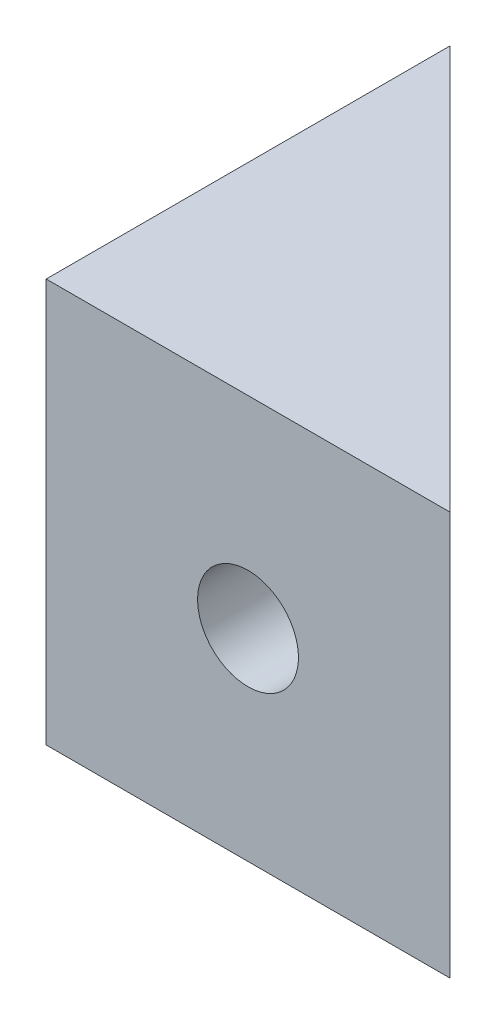
ISO-10303-21;
HEADER;
FILE_DESCRIPTION(('STEP AP214'),'2;1');
FILE_NAME('part.step','',(''),(''),'','','');
FILE_SCHEMA(('AUTOMOTIVE_DESIGN { 1 0 10303 214 1 1 1 1 }'));
ENDSEC;
DATA;
#1=APPLICATION_CONTEXT('core data for automotive mechanical design processes');
#2=APPLICATION_PROTOCOL_DEFINITION('international standard','automotive_design',2000,#1);
#3=PRODUCT_CONTEXT('',#1,'mechanical');
#4=PRODUCT('Part','Part','',(#3));
#5=PRODUCT_RELATED_PRODUCT_CATEGORY('part','',(#4));
#6=PRODUCT_DEFINITION_FORMATION('','',#4);
#7=PRODUCT_DEFINITION_CONTEXT('part definition',#1,'design');
#8=PRODUCT_DEFINITION('design','',#6,#7);
#9=PRODUCT_DEFINITION_SHAPE('','',#8);
#10=(LENGTH_UNIT() NAMED_UNIT(*) SI_UNIT(.MILLI.,.METRE.));
#11=(NAMED_UNIT(*) PLANE_ANGLE_UNIT() SI_UNIT($,.RADIAN.));
#12=(NAMED_UNIT(*) SI_UNIT($,.STERADIAN.) SOLID_ANGLE_UNIT());
#13=UNCERTAINTY_MEASURE_WITH_UNIT(LENGTH_MEASURE(1.E-05),#10,'distance_accuracy_value','');
#14=(GEOMETRIC_REPRESENTATION_CONTEXT(3) GLOBAL_UNCERTAINTY_ASSIGNED_CONTEXT((#13)) GLOBAL_UNIT_ASSIGNED_CONTEXT((#10,
#11,#12)) REPRESENTATION_CONTEXT('',''));
#15=CARTESIAN_POINT('',(0.,0.,0.));
#16=DIRECTION('',(0.,0.,1.));
#17=DIRECTION('',(1.,0.,0.));
#18=AXIS2_PLACEMENT_3D('',#15,#16,#17);
#19=CARTESIAN_POINT('',(0.,10.,-19.9999999999998));
#20=DIRECTION('',(1.,0.,0.));
#21=DIRECTION('',(0.,0.,1.));
#22=AXIS2_PLACEMENT_3D('',#19,#20,#21);
#23=PLANE('',#22);
#24=DIRECTION('',(0.,0.,-1.));
#25=VECTOR('',#24,1.);
#26=CARTESIAN_POINT('',(0.,-10.,-19.9999999999998));
#27=LINE('',#26,#25);
#28=CARTESIAN_POINT('',(0.,-10.,0.));
#29=VERTEX_POINT('',#28);
#30=CARTESIAN_POINT('',(0.,-10.,-19.9999999999998));
#31=VERTEX_POINT('',#30);
#32=EDGE_CURVE('E119',#29,#31,#27,.T.);
#33=ORIENTED_EDGE('',*,*,#32,.F.);
#34=DIRECTION('',(0.,-1.,0.));
#35=VECTOR('',#34,1.);
#36=CARTESIAN_POINT('',(0.,10.,0.));
#37=LINE('',#36,#35);
#38=CARTESIAN_POINT('',(0.,10.,0.));
#39=VERTEX_POINT('',#38);
#40=EDGE_CURVE('E113',#39,#29,#37,.T.);
#41=ORIENTED_EDGE('',*,*,#40,.F.);
#42=DIRECTION('',(0.,0.,-1.));
#43=VECTOR('',#42,1.);
#44=CARTESIAN_POINT('',(0.,10.,-19.9999999999998));
#45=LINE('',#44,#43);
#46=CARTESIAN_POINT('',(0.,10.,-19.9999999999998));
#47=VERTEX_POINT('',#46);
#48=EDGE_CURVE('E116',#39,#47,#45,.T.);
#49=ORIENTED_EDGE('',*,*,#48,.T.);
#50=DIRECTION('',(0.,-1.,0.));
#51=VECTOR('',#50,1.);
#52=CARTESIAN_POINT('',(0.,10.,-19.9999999999998));
#53=LINE('',#52,#51);
#54=EDGE_CURVE('E105',#47,#31,#53,.T.);
#55=ORIENTED_EDGE('',*,*,#54,.T.);
#56=EDGE_LOOP('',(#33,#41,#49,#55));
#57=FACE_BOUND('',#56,.T.);
#58=ADVANCED_FACE('F37',(#57),#23,.F.);
#59=CARTESIAN_POINT('',(20.,10.,0.));
#60=DIRECTION('',(-0.707106781186544,0.,0.707106781186551));
#61=DIRECTION('',(-0.707106781186551,0.,-0.707106781186544));
#62=AXIS2_PLACEMENT_3D('',#59,#60,#61);
#63=PLANE('',#62);
#64=DIRECTION('',(0.,1.,0.));
#65=VECTOR('',#64,1.);
#66=CARTESIAN_POINT('',(9.9999999999999,10.,-10.));
#67=LINE('',#66,#65);
#68=CARTESIAN_POINT('',(9.9999999999999,-2.5,-10.));
#69=VERTEX_POINT('',#68);
#70=CARTESIAN_POINT('',(9.9999999999999,-2.1,-10.));
#71=VERTEX_POINT('',#70);
#72=EDGE_CURVE('E44',#69,#71,#67,.T.);
#73=ORIENTED_EDGE('',*,*,#72,.F.);
#74=CARTESIAN_POINT('',(10.,0.,-9.9999999999999));
#75=DIRECTION('',(0.707106781186544,0.,-0.707106781186551));
#76=DIRECTION('',(0.707106781186551,0.,0.707106781186544));
#77=AXIS2_PLACEMENT_3D('',#74,#75,#76);
#78=ELLIPSE('',#77,3.53553390593272,2.5);
#79=CARTESIAN_POINT('',(9.9999999999999,2.5,-10.));
#80=VERTEX_POINT('',#79);
#81=EDGE_CURVE('E93',#80,#69,#78,.T.);
#82=ORIENTED_EDGE('',*,*,#81,.F.);
#83=CARTESIAN_POINT('',(9.9999999999999,2.1,-10.));
#84=VERTEX_POINT('',#83);
#85=EDGE_CURVE('E99',#84,#80,#67,.T.);
#86=ORIENTED_EDGE('',*,*,#85,.F.);
#87=CARTESIAN_POINT('',(10.,0.,-9.9999999999999));
#88=DIRECTION('',(0.707106781186544,0.,-0.707106781186551));
#89=DIRECTION('',(0.707106781186551,0.,0.707106781186544));
#90=AXIS2_PLACEMENT_3D('',#87,#88,#89);
#91=ELLIPSE('',#90,2.96984848098348,2.1);
#92=EDGE_CURVE('E11',#71,#84,#91,.T.);
#93=ORIENTED_EDGE('',*,*,#92,.F.);
#94=EDGE_LOOP('',(#73,#82,#86,#93));
#95=FACE_BOUND('',#94,.T.);
#96=DIRECTION('',(0.707106781186551,0.,0.707106781186544));
#97=VECTOR('',#96,1.);
#98=CARTESIAN_POINT('',(20.,-10.,0.));
#99=LINE('',#98,#97);
#100=CARTESIAN_POINT('',(20.,-10.,0.));
#101=VERTEX_POINT('',#100);
#102=EDGE_CURVE('E117',#31,#101,#99,.T.);
#103=ORIENTED_EDGE('',*,*,#102,.F.);
#104=ORIENTED_EDGE('',*,*,#54,.F.);
#105=DIRECTION('',(0.707106781186551,0.,0.707106781186544));
#106=VECTOR('',#105,1.);
#107=CARTESIAN_POINT('',(20.,10.,0.));
#108=LINE('',#107,#106);
#109=CARTESIAN_POINT('',(20.,10.,0.));
#110=VERTEX_POINT('',#109);
#111=EDGE_CURVE('E81',#47,#110,#108,.T.);
#112=ORIENTED_EDGE('',*,*,#111,.T.);
#113=DIRECTION('',(0.,-1.,0.));
#114=VECTOR('',#113,1.);
#115=CARTESIAN_POINT('',(20.,10.,0.));
#116=LINE('',#115,#114);
#117=EDGE_CURVE('E108',#110,#101,#116,.T.);
#118=ORIENTED_EDGE('',*,*,#117,.T.);
#119=EDGE_LOOP('',(#103,#104,#112,#118));
#120=FACE_BOUND('',#119,.T.);
#121=ADVANCED_FACE('F103',(#95,#120),#63,.F.);
#122=CARTESIAN_POINT('',(0.,10.,0.));
#123=DIRECTION('',(0.,0.,-1.));
#124=DIRECTION('',(1.,0.,0.));
#125=AXIS2_PLACEMENT_3D('',#122,#123,#124);
#126=PLANE('',#125);
#127=CARTESIAN_POINT('',(10.,0.,0.));
#128=DIRECTION('',(0.,0.,-1.));
#129=DIRECTION('',(-1.,0.,0.));
#130=AXIS2_PLACEMENT_3D('',#127,#128,#129);
#131=CIRCLE('',#130,2.5);
#132=CARTESIAN_POINT('',(7.5,0.,0.));
#133=VERTEX_POINT('',#132);
#134=EDGE_CURVE('E96',#133,#133,#131,.T.);
#135=ORIENTED_EDGE('',*,*,#134,.T.);
#136=EDGE_LOOP('',(#135));
#137=FACE_BOUND('',#136,.T.);
#138=DIRECTION('',(-1.,0.,0.));
#139=VECTOR('',#138,1.);
#140=CARTESIAN_POINT('',(0.,-10.,0.));
#141=LINE('',#140,#139);
#142=EDGE_CURVE('E77',#101,#29,#141,.T.);
#143=ORIENTED_EDGE('',*,*,#142,.F.);
#144=ORIENTED_EDGE('',*,*,#117,.F.);
#145=DIRECTION('',(-1.,0.,0.));
#146=VECTOR('',#145,1.);
#147=CARTESIAN_POINT('',(0.,10.,0.));
#148=LINE('',#147,#146);
#149=EDGE_CURVE('E60',#110,#39,#148,.T.);
#150=ORIENTED_EDGE('',*,*,#149,.T.);
#151=ORIENTED_EDGE('',*,*,#40,.T.);
#152=EDGE_LOOP('',(#143,#144,#150,#151));
#153=FACE_BOUND('',#152,.T.);
#154=ADVANCED_FACE('F129',(#137,#153),#126,.F.);
#155=CARTESIAN_POINT('',(0.,10.,0.));
#156=DIRECTION('',(0.,-1.,0.));
#157=DIRECTION('',(0.,0.,1.));
#158=AXIS2_PLACEMENT_3D('',#155,#156,#157);
#159=PLANE('',#158);
#160=ORIENTED_EDGE('',*,*,#48,.F.);
#161=ORIENTED_EDGE('',*,*,#149,.F.);
#162=ORIENTED_EDGE('',*,*,#111,.F.);
#163=EDGE_LOOP('',(#160,#161,#162));
#164=FACE_BOUND('',#163,.T.);
#165=ADVANCED_FACE('F149',(#164),#159,.F.);
#166=CARTESIAN_POINT('',(0.,-10.,0.));
#167=DIRECTION('',(0.,-1.,0.));
#168=DIRECTION('',(0.,0.,1.));
#169=AXIS2_PLACEMENT_3D('',#166,#167,#168);
#170=PLANE('',#169);
#171=ORIENTED_EDGE('',*,*,#32,.T.);
#172=ORIENTED_EDGE('',*,*,#102,.T.);
#173=ORIENTED_EDGE('',*,*,#142,.T.);
#174=EDGE_LOOP('',(#171,#172,#173));
#175=FACE_BOUND('',#174,.T.);
#176=ADVANCED_FACE('F147',(#175),#170,.T.);
#177=CARTESIAN_POINT('',(12.1,0.,-10.));
#178=DIRECTION('',(0.,0.,-1.));
#179=DIRECTION('',(1.,0.,0.));
#180=AXIS2_PLACEMENT_3D('',#177,#178,#179);
#181=PLANE('',#180);
#182=CARTESIAN_POINT('',(10.,0.,-10.));
#183=DIRECTION('',(0.,0.,-1.));
#184=DIRECTION('',(-1.,0.,0.));
#185=AXIS2_PLACEMENT_3D('',#182,#183,#184);
#186=CIRCLE('',#185,2.5);
#187=EDGE_CURVE('E51',#69,#80,#186,.T.);
#188=ORIENTED_EDGE('',*,*,#187,.F.);
#189=ORIENTED_EDGE('',*,*,#72,.T.);
#190=CARTESIAN_POINT('',(10.,0.,-10.));
#191=DIRECTION('',(0.,0.,-1.));
#192=DIRECTION('',(-1.,0.,0.));
#193=AXIS2_PLACEMENT_3D('',#190,#191,#192);
#194=CIRCLE('',#193,2.1);
#195=EDGE_CURVE('E95',#71,#84,#194,.T.);
#196=ORIENTED_EDGE('',*,*,#195,.T.);
#197=ORIENTED_EDGE('',*,*,#85,.T.);
#198=EDGE_LOOP('',(#188,#189,#196,#197));
#199=FACE_BOUND('',#198,.T.);
#200=ADVANCED_FACE('F100',(#199),#181,.F.);
#201=CARTESIAN_POINT('',(10.,0.,0.));
#202=DIRECTION('',(0.,0.,1.));
#203=DIRECTION('',(-1.,0.,0.));
#204=AXIS2_PLACEMENT_3D('',#201,#202,#203);
#205=CYLINDRICAL_SURFACE('',#204,2.1);
#206=ORIENTED_EDGE('',*,*,#195,.F.);
#207=ORIENTED_EDGE('',*,*,#92,.T.);
#208=EDGE_LOOP('',(#206,#207));
#209=FACE_BOUND('',#208,.T.);
#210=ADVANCED_FACE('F132',(#209),#205,.F.);
#211=CARTESIAN_POINT('',(10.,0.,0.));
#212=DIRECTION('',(0.,0.,1.));
#213=DIRECTION('',(-1.,0.,0.));
#214=AXIS2_PLACEMENT_3D('',#211,#212,#213);
#215=CYLINDRICAL_SURFACE('',#214,2.5);
#216=ORIENTED_EDGE('',*,*,#134,.F.);
#217=EDGE_LOOP('',(#216));
#218=FACE_BOUND('',#217,.T.);
#219=ORIENTED_EDGE('',*,*,#187,.T.);
#220=ORIENTED_EDGE('',*,*,#81,.T.);
#221=EDGE_LOOP('',(#219,#220));
#222=FACE_BOUND('',#221,.T.);
#223=ADVANCED_FACE('F91',(#218,#222),#215,.F.);
#224=CLOSED_SHELL('',(#58,#121,#154,#165,#176,#200,#210,#223));
#225=MANIFOLD_SOLID_BREP('B2',#224);
#226=ADVANCED_BREP_SHAPE_REPRESENTATION('',(#18,#225),#14);
#227=SHAPE_DEFINITION_REPRESENTATION(#9,#226);
ENDSEC;
END-ISO-10303-21;
